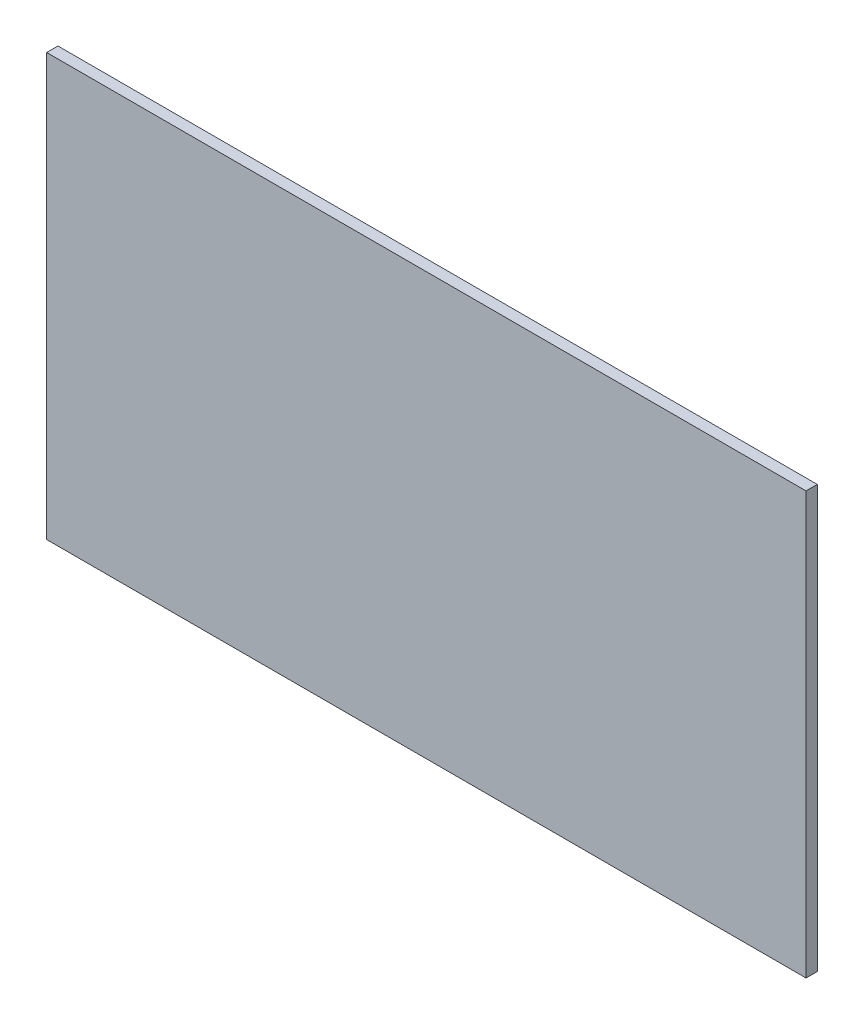
ISO-10303-21;
HEADER;
FILE_DESCRIPTION(('STEP AP214'),'2;1');
FILE_NAME('part.step','',(''),(''),'','','');
FILE_SCHEMA(('AUTOMOTIVE_DESIGN { 1 0 10303 214 1 1 1 1 }'));
ENDSEC;
DATA;
#1=APPLICATION_CONTEXT('core data for automotive mechanical design processes');
#2=APPLICATION_PROTOCOL_DEFINITION('international standard','automotive_design',2000,#1);
#3=PRODUCT_CONTEXT('',#1,'mechanical');
#4=PRODUCT('Part','Part','',(#3));
#5=PRODUCT_RELATED_PRODUCT_CATEGORY('part','',(#4));
#6=PRODUCT_DEFINITION_FORMATION('','',#4);
#7=PRODUCT_DEFINITION_CONTEXT('part definition',#1,'design');
#8=PRODUCT_DEFINITION('design','',#6,#7);
#9=PRODUCT_DEFINITION_SHAPE('','',#8);
#10=(LENGTH_UNIT() NAMED_UNIT(*) SI_UNIT(.MILLI.,.METRE.));
#11=(NAMED_UNIT(*) PLANE_ANGLE_UNIT() SI_UNIT($,.RADIAN.));
#12=(NAMED_UNIT(*) SI_UNIT($,.STERADIAN.) SOLID_ANGLE_UNIT());
#13=UNCERTAINTY_MEASURE_WITH_UNIT(LENGTH_MEASURE(1.E-05),#10,'distance_accuracy_value','');
#14=(GEOMETRIC_REPRESENTATION_CONTEXT(3) GLOBAL_UNCERTAINTY_ASSIGNED_CONTEXT((#13)) GLOBAL_UNIT_ASSIGNED_CONTEXT((#10,
#11,#12)) REPRESENTATION_CONTEXT('',''));
#15=CARTESIAN_POINT('',(0.,0.,0.));
#16=DIRECTION('',(0.,0.,1.));
#17=DIRECTION('',(1.,0.,0.));
#18=AXIS2_PLACEMENT_3D('',#15,#16,#17);
#19=CARTESIAN_POINT('',(67.5,-37.5,2.));
#20=DIRECTION('',(-1.,0.,0.));
#21=DIRECTION('',(0.,0.,1.));
#22=AXIS2_PLACEMENT_3D('',#19,#20,#21);
#23=PLANE('',#22);
#24=DIRECTION('',(0.,1.,0.));
#25=VECTOR('',#24,1.);
#26=CARTESIAN_POINT('',(67.5,-37.5,0.));
#27=LINE('',#26,#25);
#28=CARTESIAN_POINT('',(67.5,-37.5,0.));
#29=VERTEX_POINT('',#28);
#30=CARTESIAN_POINT('',(67.5,37.5,0.));
#31=VERTEX_POINT('',#30);
#32=EDGE_CURVE('E98',#29,#31,#27,.T.);
#33=ORIENTED_EDGE('',*,*,#32,.T.);
#34=DIRECTION('',(0.,0.,-1.));
#35=VECTOR('',#34,1.);
#36=CARTESIAN_POINT('',(67.5,37.5,2.));
#37=LINE('',#36,#35);
#38=CARTESIAN_POINT('',(67.5,37.5,2.));
#39=VERTEX_POINT('',#38);
#40=EDGE_CURVE('E11',#39,#31,#37,.T.);
#41=ORIENTED_EDGE('',*,*,#40,.F.);
#42=DIRECTION('',(0.,1.,0.));
#43=VECTOR('',#42,1.);
#44=CARTESIAN_POINT('',(67.5,-37.5,2.));
#45=LINE('',#44,#43);
#46=CARTESIAN_POINT('',(67.5,-37.5,2.));
#47=VERTEX_POINT('',#46);
#48=EDGE_CURVE('E86',#47,#39,#45,.T.);
#49=ORIENTED_EDGE('',*,*,#48,.F.);
#50=DIRECTION('',(0.,0.,-1.));
#51=VECTOR('',#50,1.);
#52=CARTESIAN_POINT('',(67.5,-37.5,2.));
#53=LINE('',#52,#51);
#54=EDGE_CURVE('E94',#47,#29,#53,.T.);
#55=ORIENTED_EDGE('',*,*,#54,.T.);
#56=EDGE_LOOP('',(#33,#41,#49,#55));
#57=FACE_BOUND('',#56,.T.);
#58=ADVANCED_FACE('F35',(#57),#23,.F.);
#59=CARTESIAN_POINT('',(-67.5,37.5,2.));
#60=DIRECTION('',(0.,-1.,0.));
#61=DIRECTION('',(0.,0.,-1.));
#62=AXIS2_PLACEMENT_3D('',#59,#60,#61);
#63=PLANE('',#62);
#64=DIRECTION('',(-1.,0.,0.));
#65=VECTOR('',#64,1.);
#66=CARTESIAN_POINT('',(-67.5,37.5,0.));
#67=LINE('',#66,#65);
#68=CARTESIAN_POINT('',(-67.5,37.5,0.));
#69=VERTEX_POINT('',#68);
#70=EDGE_CURVE('E90',#31,#69,#67,.T.);
#71=ORIENTED_EDGE('',*,*,#70,.T.);
#72=DIRECTION('',(0.,0.,-1.));
#73=VECTOR('',#72,1.);
#74=CARTESIAN_POINT('',(-67.5,37.5,2.));
#75=LINE('',#74,#73);
#76=CARTESIAN_POINT('',(-67.5,37.5,2.));
#77=VERTEX_POINT('',#76);
#78=EDGE_CURVE('E43',#77,#69,#75,.T.);
#79=ORIENTED_EDGE('',*,*,#78,.F.);
#80=DIRECTION('',(-1.,0.,0.));
#81=VECTOR('',#80,1.);
#82=CARTESIAN_POINT('',(-67.5,37.5,2.));
#83=LINE('',#82,#81);
#84=EDGE_CURVE('E81',#39,#77,#83,.T.);
#85=ORIENTED_EDGE('',*,*,#84,.F.);
#86=ORIENTED_EDGE('',*,*,#40,.T.);
#87=EDGE_LOOP('',(#71,#79,#85,#86));
#88=FACE_BOUND('',#87,.T.);
#89=ADVANCED_FACE('F89',(#88),#63,.F.);
#90=CARTESIAN_POINT('',(-67.5,-37.5,2.));
#91=DIRECTION('',(1.,0.,0.));
#92=DIRECTION('',(0.,0.,-1.));
#93=AXIS2_PLACEMENT_3D('',#90,#91,#92);
#94=PLANE('',#93);
#95=DIRECTION('',(0.,-1.,0.));
#96=VECTOR('',#95,1.);
#97=CARTESIAN_POINT('',(-67.5,-37.5,0.));
#98=LINE('',#97,#96);
#99=CARTESIAN_POINT('',(-67.5,-37.5,0.));
#100=VERTEX_POINT('',#99);
#101=EDGE_CURVE('E68',#69,#100,#98,.T.);
#102=ORIENTED_EDGE('',*,*,#101,.T.);
#103=DIRECTION('',(0.,0.,-1.));
#104=VECTOR('',#103,1.);
#105=CARTESIAN_POINT('',(-67.5,-37.5,2.));
#106=LINE('',#105,#104);
#107=CARTESIAN_POINT('',(-67.5,-37.5,2.));
#108=VERTEX_POINT('',#107);
#109=EDGE_CURVE('E91',#108,#100,#106,.T.);
#110=ORIENTED_EDGE('',*,*,#109,.F.);
#111=DIRECTION('',(0.,-1.,0.));
#112=VECTOR('',#111,1.);
#113=CARTESIAN_POINT('',(-67.5,-37.5,2.));
#114=LINE('',#113,#112);
#115=EDGE_CURVE('E84',#77,#108,#114,.T.);
#116=ORIENTED_EDGE('',*,*,#115,.F.);
#117=ORIENTED_EDGE('',*,*,#78,.T.);
#118=EDGE_LOOP('',(#102,#110,#116,#117));
#119=FACE_BOUND('',#118,.T.);
#120=ADVANCED_FACE('F92',(#119),#94,.F.);
#121=CARTESIAN_POINT('',(-67.5,-37.5,2.));
#122=DIRECTION('',(0.,1.,0.));
#123=DIRECTION('',(0.,0.,1.));
#124=AXIS2_PLACEMENT_3D('',#121,#122,#123);
#125=PLANE('',#124);
#126=DIRECTION('',(1.,0.,0.));
#127=VECTOR('',#126,1.);
#128=CARTESIAN_POINT('',(-67.5,-37.5,0.));
#129=LINE('',#128,#127);
#130=EDGE_CURVE('E74',#100,#29,#129,.T.);
#131=ORIENTED_EDGE('',*,*,#130,.T.);
#132=ORIENTED_EDGE('',*,*,#54,.F.);
#133=DIRECTION('',(1.,0.,0.));
#134=VECTOR('',#133,1.);
#135=CARTESIAN_POINT('',(-67.5,-37.5,2.));
#136=LINE('',#135,#134);
#137=EDGE_CURVE('E51',#108,#47,#136,.T.);
#138=ORIENTED_EDGE('',*,*,#137,.F.);
#139=ORIENTED_EDGE('',*,*,#109,.T.);
#140=EDGE_LOOP('',(#131,#132,#138,#139));
#141=FACE_BOUND('',#140,.T.);
#142=ADVANCED_FACE('F105',(#141),#125,.F.);
#143=CARTESIAN_POINT('',(0.,0.,2.));
#144=DIRECTION('',(0.,0.,-1.));
#145=DIRECTION('',(-1.,0.,0.));
#146=AXIS2_PLACEMENT_3D('',#143,#144,#145);
#147=PLANE('',#146);
#148=ORIENTED_EDGE('',*,*,#48,.T.);
#149=ORIENTED_EDGE('',*,*,#84,.T.);
#150=ORIENTED_EDGE('',*,*,#115,.T.);
#151=ORIENTED_EDGE('',*,*,#137,.T.);
#152=EDGE_LOOP('',(#148,#149,#150,#151));
#153=FACE_BOUND('',#152,.T.);
#154=ADVANCED_FACE('F82',(#153),#147,.F.);
#155=CARTESIAN_POINT('',(0.,0.,0.));
#156=DIRECTION('',(0.,0.,-1.));
#157=DIRECTION('',(-1.,0.,0.));
#158=AXIS2_PLACEMENT_3D('',#155,#156,#157);
#159=PLANE('',#158);
#160=ORIENTED_EDGE('',*,*,#32,.F.);
#161=ORIENTED_EDGE('',*,*,#130,.F.);
#162=ORIENTED_EDGE('',*,*,#101,.F.);
#163=ORIENTED_EDGE('',*,*,#70,.F.);
#164=EDGE_LOOP('',(#160,#161,#162,#163));
#165=FACE_BOUND('',#164,.T.);
#166=ADVANCED_FACE('F108',(#165),#159,.T.);
#167=CLOSED_SHELL('',(#58,#89,#120,#142,#154,#166));
#168=MANIFOLD_SOLID_BREP('B2',#167);
#169=ADVANCED_BREP_SHAPE_REPRESENTATION('',(#18,#168),#14);
#170=SHAPE_DEFINITION_REPRESENTATION(#9,#169);
ENDSEC;
END-ISO-10303-21;
